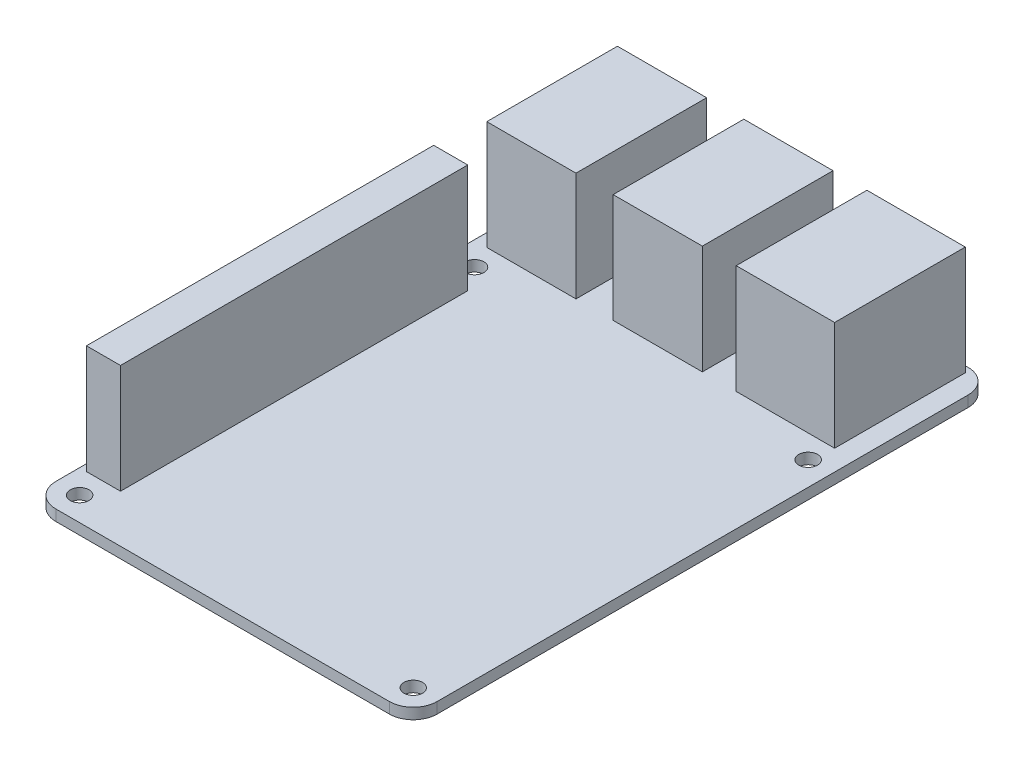
ISO-10303-21;
HEADER;
FILE_DESCRIPTION(('STEP AP214'),'2;1');
FILE_NAME('part.step','',(''),(''),'','','');
FILE_SCHEMA(('AUTOMOTIVE_DESIGN { 1 0 10303 214 1 1 1 1 }'));
ENDSEC;
DATA;
#1=APPLICATION_CONTEXT('core data for automotive mechanical design processes');
#2=APPLICATION_PROTOCOL_DEFINITION('international standard','automotive_design',2000,#1);
#3=PRODUCT_CONTEXT('',#1,'mechanical');
#4=PRODUCT('Part','Part','',(#3));
#5=PRODUCT_RELATED_PRODUCT_CATEGORY('part','',(#4));
#6=PRODUCT_DEFINITION_FORMATION('','',#4);
#7=PRODUCT_DEFINITION_CONTEXT('part definition',#1,'design');
#8=PRODUCT_DEFINITION('design','',#6,#7);
#9=PRODUCT_DEFINITION_SHAPE('','',#8);
#10=(LENGTH_UNIT() NAMED_UNIT(*) SI_UNIT(.MILLI.,.METRE.));
#11=(NAMED_UNIT(*) PLANE_ANGLE_UNIT() SI_UNIT($,.RADIAN.));
#12=(NAMED_UNIT(*) SI_UNIT($,.STERADIAN.) SOLID_ANGLE_UNIT());
#13=UNCERTAINTY_MEASURE_WITH_UNIT(LENGTH_MEASURE(1.E-05),#10,'distance_accuracy_value','');
#14=(GEOMETRIC_REPRESENTATION_CONTEXT(3) GLOBAL_UNCERTAINTY_ASSIGNED_CONTEXT((#13)) GLOBAL_UNIT_ASSIGNED_CONTEXT((#10,
#11,#12)) REPRESENTATION_CONTEXT('',''));
#15=CARTESIAN_POINT('',(0.,0.,0.));
#16=DIRECTION('',(0.,0.,1.));
#17=DIRECTION('',(1.,0.,0.));
#18=AXIS2_PLACEMENT_3D('',#15,#16,#17);
#19=CARTESIAN_POINT('',(0.,1.6,0.));
#20=DIRECTION('',(0.,-1.,0.));
#21=DIRECTION('',(0.,0.,-1.));
#22=AXIS2_PLACEMENT_3D('',#19,#20,#21);
#23=PLANE('',#22);
#24=DIRECTION('',(0.,0.,-1.));
#25=VECTOR('',#24,1.);
#26=CARTESIAN_POINT('',(52.9743321549389,1.6,-64.9067176993025));
#27=LINE('',#26,#25);
#28=CARTESIAN_POINT('',(52.9743321549389,1.6,-64.9067176993025));
#29=VERTEX_POINT('',#28);
#30=CARTESIAN_POINT('',(52.9743321549389,1.6,-84.0963499858589));
#31=VERTEX_POINT('',#30);
#32=EDGE_CURVE('E225',#29,#31,#27,.T.);
#33=ORIENTED_EDGE('',*,*,#32,.F.);
#34=DIRECTION('',(1.,0.,0.));
#35=VECTOR('',#34,1.);
#36=CARTESIAN_POINT('',(38.5256678450611,1.6,-64.9067176993025));
#37=LINE('',#36,#35);
#38=CARTESIAN_POINT('',(38.5256678450611,1.6,-64.9067176993025));
#39=VERTEX_POINT('',#38);
#40=EDGE_CURVE('E241',#39,#29,#37,.T.);
#41=ORIENTED_EDGE('',*,*,#40,.F.);
#42=DIRECTION('',(0.,0.,1.));
#43=VECTOR('',#42,1.);
#44=CARTESIAN_POINT('',(38.5256678450611,1.6,-64.9067176993025));
#45=LINE('',#44,#43);
#46=CARTESIAN_POINT('',(38.5256678450611,1.6,-84.0963499858589));
#47=VERTEX_POINT('',#46);
#48=EDGE_CURVE('E254',#47,#39,#45,.T.);
#49=ORIENTED_EDGE('',*,*,#48,.F.);
#50=DIRECTION('',(-1.,0.,0.));
#51=VECTOR('',#50,1.);
#52=CARTESIAN_POINT('',(38.5256678450611,1.6,-84.0963499858589));
#53=LINE('',#52,#51);
#54=EDGE_CURVE('E230',#31,#47,#53,.T.);
#55=ORIENTED_EDGE('',*,*,#54,.F.);
#56=EDGE_LOOP('',(#33,#41,#49,#55));
#57=FACE_BOUND('',#56,.T.);
#58=DIRECTION('',(0.,0.,-1.));
#59=VECTOR('',#58,1.);
#60=CARTESIAN_POINT('',(14.9885480349821,1.6,-64.9067176993025));
#61=LINE('',#60,#59);
#62=CARTESIAN_POINT('',(14.9885480349821,1.6,-64.9067176993025));
#63=VERTEX_POINT('',#62);
#64=CARTESIAN_POINT('',(14.9885480349821,1.6,-84.0963499858589));
#65=VERTEX_POINT('',#64);
#66=EDGE_CURVE('E321',#63,#65,#61,.T.);
#67=ORIENTED_EDGE('',*,*,#66,.F.);
#68=DIRECTION('',(1.,0.,0.));
#69=VECTOR('',#68,1.);
#70=CARTESIAN_POINT('',(1.88854803498207,1.6,-64.9067176993025));
#71=LINE('',#70,#69);
#72=CARTESIAN_POINT('',(1.88854803498207,1.6,-64.9067176993025));
#73=VERTEX_POINT('',#72);
#74=EDGE_CURVE('E327',#73,#63,#71,.T.);
#75=ORIENTED_EDGE('',*,*,#74,.F.);
#76=DIRECTION('',(0.,0.,1.));
#77=VECTOR('',#76,1.);
#78=CARTESIAN_POINT('',(1.88854803498207,1.6,-64.9067176993025));
#79=LINE('',#78,#77);
#80=CARTESIAN_POINT('',(1.88854803498207,1.6,-84.0963499858589));
#81=VERTEX_POINT('',#80);
#82=EDGE_CURVE('E344',#81,#73,#79,.T.);
#83=ORIENTED_EDGE('',*,*,#82,.F.);
#84=DIRECTION('',(-1.,0.,0.));
#85=VECTOR('',#84,1.);
#86=CARTESIAN_POINT('',(1.88854803498207,1.6,-84.0963499858589));
#87=LINE('',#86,#85);
#88=EDGE_CURVE('E340',#65,#81,#87,.T.);
#89=ORIENTED_EDGE('',*,*,#88,.F.);
#90=EDGE_LOOP('',(#67,#75,#83,#89));
#91=FACE_BOUND('',#90,.T.);
#92=DIRECTION('',(0.,0.,-1.));
#93=VECTOR('',#92,1.);
#94=CARTESIAN_POINT('',(56.,1.6,0.));
#95=LINE('',#94,#93);
#96=CARTESIAN_POINT('',(56.,1.6,-3.5));
#97=VERTEX_POINT('',#96);
#98=CARTESIAN_POINT('',(56.,1.6,-81.5));
#99=VERTEX_POINT('',#98);
#100=EDGE_CURVE('E408',#97,#99,#95,.T.);
#101=ORIENTED_EDGE('',*,*,#100,.T.);
#102=CARTESIAN_POINT('',(52.5,1.6,-81.5));
#103=DIRECTION('',(0.,-1.,0.));
#104=DIRECTION('',(0.,0.,-1.));
#105=AXIS2_PLACEMENT_3D('',#102,#103,#104);
#106=CIRCLE('',#105,3.5);
#107=CARTESIAN_POINT('',(52.5,1.6,-85.));
#108=VERTEX_POINT('',#107);
#109=EDGE_CURVE('E465',#99,#108,#106,.F.);
#110=ORIENTED_EDGE('',*,*,#109,.T.);
#111=DIRECTION('',(-1.,0.,0.));
#112=VECTOR('',#111,1.);
#113=CARTESIAN_POINT('',(0.,1.6,-85.));
#114=LINE('',#113,#112);
#115=CARTESIAN_POINT('',(3.5,1.6,-85.));
#116=VERTEX_POINT('',#115);
#117=EDGE_CURVE('E412',#108,#116,#114,.T.);
#118=ORIENTED_EDGE('',*,*,#117,.T.);
#119=CARTESIAN_POINT('',(3.5,1.6,-81.5));
#120=DIRECTION('',(0.,-1.,0.));
#121=DIRECTION('',(0.,0.,-1.));
#122=AXIS2_PLACEMENT_3D('',#119,#120,#121);
#123=CIRCLE('',#122,3.5);
#124=CARTESIAN_POINT('',(0.,1.6,-81.5));
#125=VERTEX_POINT('',#124);
#126=EDGE_CURVE('E462',#116,#125,#123,.F.);
#127=ORIENTED_EDGE('',*,*,#126,.T.);
#128=DIRECTION('',(0.,0.,1.));
#129=VECTOR('',#128,1.);
#130=CARTESIAN_POINT('',(0.,1.6,0.));
#131=LINE('',#130,#129);
#132=CARTESIAN_POINT('',(0.,1.6,-3.5));
#133=VERTEX_POINT('',#132);
#134=EDGE_CURVE('E399',#125,#133,#131,.T.);
#135=ORIENTED_EDGE('',*,*,#134,.T.);
#136=CARTESIAN_POINT('',(3.5,1.6,-3.5));
#137=DIRECTION('',(0.,-1.,0.));
#138=DIRECTION('',(0.,0.,-1.));
#139=AXIS2_PLACEMENT_3D('',#136,#137,#138);
#140=CIRCLE('',#139,3.5);
#141=CARTESIAN_POINT('',(3.5,1.6,0.));
#142=VERTEX_POINT('',#141);
#143=EDGE_CURVE('E459',#133,#142,#140,.F.);
#144=ORIENTED_EDGE('',*,*,#143,.T.);
#145=DIRECTION('',(1.,0.,0.));
#146=VECTOR('',#145,1.);
#147=CARTESIAN_POINT('',(0.,1.6,0.));
#148=LINE('',#147,#146);
#149=CARTESIAN_POINT('',(52.5,1.6,0.));
#150=VERTEX_POINT('',#149);
#151=EDGE_CURVE('E403',#142,#150,#148,.T.);
#152=ORIENTED_EDGE('',*,*,#151,.T.);
#153=CARTESIAN_POINT('',(52.5,1.6,-3.5));
#154=DIRECTION('',(0.,-1.,0.));
#155=DIRECTION('',(0.,0.,-1.));
#156=AXIS2_PLACEMENT_3D('',#153,#154,#155);
#157=CIRCLE('',#156,3.5);
#158=EDGE_CURVE('E456',#150,#97,#157,.F.);
#159=ORIENTED_EDGE('',*,*,#158,.T.);
#160=EDGE_LOOP('',(#101,#110,#118,#127,#135,#144,#152,#159));
#161=FACE_BOUND('',#160,.T.);
#162=CARTESIAN_POINT('',(3.5,1.6,-3.5));
#163=DIRECTION('',(0.,1.,0.));
#164=DIRECTION('',(0.,0.,1.));
#165=AXIS2_PLACEMENT_3D('',#162,#163,#164);
#166=CIRCLE('',#165,1.375);
#167=CARTESIAN_POINT('',(3.5,1.6,-2.125));
#168=VERTEX_POINT('',#167);
#169=EDGE_CURVE('E391',#168,#168,#166,.T.);
#170=ORIENTED_EDGE('',*,*,#169,.F.);
#171=EDGE_LOOP('',(#170));
#172=FACE_BOUND('',#171,.T.);
#173=CARTESIAN_POINT('',(52.5,1.6,-3.5));
#174=DIRECTION('',(0.,1.,0.));
#175=DIRECTION('',(0.,0.,1.));
#176=AXIS2_PLACEMENT_3D('',#173,#174,#175);
#177=CIRCLE('',#176,1.375);
#178=CARTESIAN_POINT('',(52.5,1.6,-2.125));
#179=VERTEX_POINT('',#178);
#180=EDGE_CURVE('E383',#179,#179,#177,.T.);
#181=ORIENTED_EDGE('',*,*,#180,.F.);
#182=EDGE_LOOP('',(#181));
#183=FACE_BOUND('',#182,.T.);
#184=CARTESIAN_POINT('',(52.5,1.6,-61.5));
#185=DIRECTION('',(0.,1.,0.));
#186=DIRECTION('',(0.,0.,1.));
#187=AXIS2_PLACEMENT_3D('',#184,#185,#186);
#188=CIRCLE('',#187,1.375);
#189=CARTESIAN_POINT('',(52.5,1.6,-60.125));
#190=VERTEX_POINT('',#189);
#191=EDGE_CURVE('E375',#190,#190,#188,.T.);
#192=ORIENTED_EDGE('',*,*,#191,.F.);
#193=EDGE_LOOP('',(#192));
#194=FACE_BOUND('',#193,.T.);
#195=CARTESIAN_POINT('',(3.5,1.6,-61.5));
#196=DIRECTION('',(0.,1.,0.));
#197=DIRECTION('',(0.,0.,1.));
#198=AXIS2_PLACEMENT_3D('',#195,#196,#197);
#199=CIRCLE('',#198,1.375);
#200=CARTESIAN_POINT('',(3.5,1.6,-60.125));
#201=VERTEX_POINT('',#200);
#202=EDGE_CURVE('E367',#201,#201,#199,.T.);
#203=ORIENTED_EDGE('',*,*,#202,.F.);
#204=EDGE_LOOP('',(#203));
#205=FACE_BOUND('',#204,.T.);
#206=DIRECTION('',(0.,0.,-1.));
#207=VECTOR('',#206,1.);
#208=CARTESIAN_POINT('',(33.55,1.6,-64.9067176993025));
#209=LINE('',#208,#207);
#210=CARTESIAN_POINT('',(33.55,1.6,-64.9067176993025));
#211=VERTEX_POINT('',#210);
#212=CARTESIAN_POINT('',(33.55,1.6,-84.0963499858589));
#213=VERTEX_POINT('',#212);
#214=EDGE_CURVE('E276',#211,#213,#209,.T.);
#215=ORIENTED_EDGE('',*,*,#214,.F.);
#216=DIRECTION('',(1.,0.,0.));
#217=VECTOR('',#216,1.);
#218=CARTESIAN_POINT('',(20.45,1.6,-64.9067176993025));
#219=LINE('',#218,#217);
#220=CARTESIAN_POINT('',(20.45,1.6,-64.9067176993025));
#221=VERTEX_POINT('',#220);
#222=EDGE_CURVE('E282',#221,#211,#219,.T.);
#223=ORIENTED_EDGE('',*,*,#222,.F.);
#224=DIRECTION('',(0.,0.,1.));
#225=VECTOR('',#224,1.);
#226=CARTESIAN_POINT('',(20.45,1.6,-64.9067176993025));
#227=LINE('',#226,#225);
#228=CARTESIAN_POINT('',(20.45,1.6,-84.0963499858589));
#229=VERTEX_POINT('',#228);
#230=EDGE_CURVE('E299',#229,#221,#227,.T.);
#231=ORIENTED_EDGE('',*,*,#230,.F.);
#232=DIRECTION('',(-1.,0.,0.));
#233=VECTOR('',#232,1.);
#234=CARTESIAN_POINT('',(20.45,1.6,-84.0963499858589));
#235=LINE('',#234,#233);
#236=EDGE_CURVE('E295',#213,#229,#235,.T.);
#237=ORIENTED_EDGE('',*,*,#236,.F.);
#238=EDGE_LOOP('',(#215,#223,#231,#237));
#239=FACE_BOUND('',#238,.T.);
#240=DIRECTION('',(0.,0.,-1.));
#241=VECTOR('',#240,1.);
#242=CARTESIAN_POINT('',(6.,1.6,-7.00000000000001));
#243=LINE('',#242,#241);
#244=CARTESIAN_POINT('',(6.,1.6,-7.00000000000001));
#245=VERTEX_POINT('',#244);
#246=CARTESIAN_POINT('',(6.,1.6,-58.));
#247=VERTEX_POINT('',#246);
#248=EDGE_CURVE('E223',#245,#247,#243,.T.);
#249=ORIENTED_EDGE('',*,*,#248,.F.);
#250=DIRECTION('',(1.,0.,0.));
#251=VECTOR('',#250,1.);
#252=CARTESIAN_POINT('',(1.,1.6,-7.00000000000001));
#253=LINE('',#252,#251);
#254=CARTESIAN_POINT('',(1.,1.6,-7.00000000000001));
#255=VERTEX_POINT('',#254);
#256=EDGE_CURVE('E220',#255,#245,#253,.T.);
#257=ORIENTED_EDGE('',*,*,#256,.F.);
#258=DIRECTION('',(0.,0.,1.));
#259=VECTOR('',#258,1.);
#260=CARTESIAN_POINT('',(1.,1.6,-7.00000000000001));
#261=LINE('',#260,#259);
#262=CARTESIAN_POINT('',(1.,1.6,-58.));
#263=VERTEX_POINT('',#262);
#264=EDGE_CURVE('E60',#263,#255,#261,.T.);
#265=ORIENTED_EDGE('',*,*,#264,.F.);
#266=DIRECTION('',(-1.,0.,0.));
#267=VECTOR('',#266,1.);
#268=CARTESIAN_POINT('',(1.,1.6,-58.));
#269=LINE('',#268,#267);
#270=EDGE_CURVE('E55',#247,#263,#269,.T.);
#271=ORIENTED_EDGE('',*,*,#270,.F.);
#272=EDGE_LOOP('',(#249,#257,#265,#271));
#273=FACE_BOUND('',#272,.T.);
#274=ADVANCED_FACE('F39',(#57,#91,#161,#172,#183,#194,#205,#239,#273),#23,.F.);
#275=CARTESIAN_POINT('',(0.,0.,0.));
#276=DIRECTION('',(0.,-1.,0.));
#277=DIRECTION('',(0.,0.,-1.));
#278=AXIS2_PLACEMENT_3D('',#275,#276,#277);
#279=PLANE('',#278);
#280=CARTESIAN_POINT('',(52.5,0.,-61.5));
#281=DIRECTION('',(0.,1.,0.));
#282=DIRECTION('',(0.,0.,1.));
#283=AXIS2_PLACEMENT_3D('',#280,#281,#282);
#284=CIRCLE('',#283,1.375);
#285=CARTESIAN_POINT('',(52.5,0.,-60.125));
#286=VERTEX_POINT('',#285);
#287=EDGE_CURVE('E371',#286,#286,#284,.T.);
#288=ORIENTED_EDGE('',*,*,#287,.T.);
#289=EDGE_LOOP('',(#288));
#290=FACE_BOUND('',#289,.T.);
#291=CARTESIAN_POINT('',(3.5,0.,-3.5));
#292=DIRECTION('',(0.,1.,0.));
#293=DIRECTION('',(0.,0.,1.));
#294=AXIS2_PLACEMENT_3D('',#291,#292,#293);
#295=CIRCLE('',#294,1.375);
#296=CARTESIAN_POINT('',(3.5,0.,-2.125));
#297=VERTEX_POINT('',#296);
#298=EDGE_CURVE('E387',#297,#297,#295,.T.);
#299=ORIENTED_EDGE('',*,*,#298,.T.);
#300=EDGE_LOOP('',(#299));
#301=FACE_BOUND('',#300,.T.);
#302=DIRECTION('',(-1.,0.,0.));
#303=VECTOR('',#302,1.);
#304=CARTESIAN_POINT('',(0.,0.,-85.));
#305=LINE('',#304,#303);
#306=CARTESIAN_POINT('',(52.5,0.,-85.));
#307=VERTEX_POINT('',#306);
#308=CARTESIAN_POINT('',(3.5,0.,-85.));
#309=VERTEX_POINT('',#308);
#310=EDGE_CURVE('E404',#307,#309,#305,.T.);
#311=ORIENTED_EDGE('',*,*,#310,.F.);
#312=CARTESIAN_POINT('',(52.5,0.,-81.5));
#313=DIRECTION('',(0.,-1.,0.));
#314=DIRECTION('',(0.,0.,-1.));
#315=AXIS2_PLACEMENT_3D('',#312,#313,#314);
#316=CIRCLE('',#315,3.5);
#317=CARTESIAN_POINT('',(56.,0.,-81.5));
#318=VERTEX_POINT('',#317);
#319=EDGE_CURVE('E446',#307,#318,#316,.T.);
#320=ORIENTED_EDGE('',*,*,#319,.T.);
#321=DIRECTION('',(0.,0.,-1.));
#322=VECTOR('',#321,1.);
#323=CARTESIAN_POINT('',(56.,0.,0.));
#324=LINE('',#323,#322);
#325=CARTESIAN_POINT('',(56.,0.,-3.5));
#326=VERTEX_POINT('',#325);
#327=EDGE_CURVE('E424',#326,#318,#324,.T.);
#328=ORIENTED_EDGE('',*,*,#327,.F.);
#329=CARTESIAN_POINT('',(52.5,0.,-3.5));
#330=DIRECTION('',(0.,-1.,0.));
#331=DIRECTION('',(0.,0.,-1.));
#332=AXIS2_PLACEMENT_3D('',#329,#330,#331);
#333=CIRCLE('',#332,3.5);
#334=CARTESIAN_POINT('',(52.5,0.,0.));
#335=VERTEX_POINT('',#334);
#336=EDGE_CURVE('E437',#326,#335,#333,.T.);
#337=ORIENTED_EDGE('',*,*,#336,.T.);
#338=DIRECTION('',(1.,0.,0.));
#339=VECTOR('',#338,1.);
#340=CARTESIAN_POINT('',(0.,0.,0.));
#341=LINE('',#340,#339);
#342=CARTESIAN_POINT('',(3.5,0.,0.));
#343=VERTEX_POINT('',#342);
#344=EDGE_CURVE('E420',#343,#335,#341,.T.);
#345=ORIENTED_EDGE('',*,*,#344,.F.);
#346=CARTESIAN_POINT('',(3.5,0.,-3.5));
#347=DIRECTION('',(0.,-1.,0.));
#348=DIRECTION('',(0.,0.,-1.));
#349=AXIS2_PLACEMENT_3D('',#346,#347,#348);
#350=CIRCLE('',#349,3.5);
#351=CARTESIAN_POINT('',(0.,0.,-3.5));
#352=VERTEX_POINT('',#351);
#353=EDGE_CURVE('E440',#343,#352,#350,.T.);
#354=ORIENTED_EDGE('',*,*,#353,.T.);
#355=DIRECTION('',(0.,0.,1.));
#356=VECTOR('',#355,1.);
#357=CARTESIAN_POINT('',(0.,0.,0.));
#358=LINE('',#357,#356);
#359=CARTESIAN_POINT('',(0.,0.,-81.5));
#360=VERTEX_POINT('',#359);
#361=EDGE_CURVE('E395',#360,#352,#358,.T.);
#362=ORIENTED_EDGE('',*,*,#361,.F.);
#363=CARTESIAN_POINT('',(3.5,0.,-81.5));
#364=DIRECTION('',(0.,-1.,0.));
#365=DIRECTION('',(0.,0.,-1.));
#366=AXIS2_PLACEMENT_3D('',#363,#364,#365);
#367=CIRCLE('',#366,3.5);
#368=EDGE_CURVE('E443',#360,#309,#367,.T.);
#369=ORIENTED_EDGE('',*,*,#368,.T.);
#370=EDGE_LOOP('',(#311,#320,#328,#337,#345,#354,#362,#369));
#371=FACE_BOUND('',#370,.T.);
#372=CARTESIAN_POINT('',(52.5,0.,-3.5));
#373=DIRECTION('',(0.,1.,0.));
#374=DIRECTION('',(0.,0.,1.));
#375=AXIS2_PLACEMENT_3D('',#372,#373,#374);
#376=CIRCLE('',#375,1.375);
#377=CARTESIAN_POINT('',(52.5,0.,-2.125));
#378=VERTEX_POINT('',#377);
#379=EDGE_CURVE('E379',#378,#378,#376,.T.);
#380=ORIENTED_EDGE('',*,*,#379,.T.);
#381=EDGE_LOOP('',(#380));
#382=FACE_BOUND('',#381,.T.);
#383=CARTESIAN_POINT('',(3.5,0.,-61.5));
#384=DIRECTION('',(0.,1.,0.));
#385=DIRECTION('',(0.,0.,1.));
#386=AXIS2_PLACEMENT_3D('',#383,#384,#385);
#387=CIRCLE('',#386,1.375);
#388=CARTESIAN_POINT('',(3.5,0.,-60.125));
#389=VERTEX_POINT('',#388);
#390=EDGE_CURVE('E366',#389,#389,#387,.T.);
#391=ORIENTED_EDGE('',*,*,#390,.T.);
#392=EDGE_LOOP('',(#391));
#393=FACE_BOUND('',#392,.T.);
#394=ADVANCED_FACE('F494',(#290,#301,#371,#382,#393),#279,.T.);
#395=CARTESIAN_POINT('',(0.,1.6,0.));
#396=DIRECTION('',(1.,0.,0.));
#397=DIRECTION('',(0.,0.,-1.));
#398=AXIS2_PLACEMENT_3D('',#395,#396,#397);
#399=PLANE('',#398);
#400=ORIENTED_EDGE('',*,*,#134,.F.);
#401=DIRECTION('',(0.,-1.,0.));
#402=VECTOR('',#401,1.);
#403=CARTESIAN_POINT('',(0.,1.6,-81.5));
#404=LINE('',#403,#402);
#405=EDGE_CURVE('E471',#125,#360,#404,.T.);
#406=ORIENTED_EDGE('',*,*,#405,.T.);
#407=ORIENTED_EDGE('',*,*,#361,.T.);
#408=DIRECTION('',(0.,-1.,0.));
#409=VECTOR('',#408,1.);
#410=CARTESIAN_POINT('',(0.,1.6,-3.5));
#411=LINE('',#410,#409);
#412=EDGE_CURVE('E468',#352,#133,#411,.F.);
#413=ORIENTED_EDGE('',*,*,#412,.T.);
#414=EDGE_LOOP('',(#400,#406,#407,#413));
#415=FACE_BOUND('',#414,.T.);
#416=ADVANCED_FACE('F511',(#415),#399,.F.);
#417=CARTESIAN_POINT('',(0.,1.6,0.));
#418=DIRECTION('',(0.,0.,-1.));
#419=DIRECTION('',(-1.,0.,0.));
#420=AXIS2_PLACEMENT_3D('',#417,#418,#419);
#421=PLANE('',#420);
#422=ORIENTED_EDGE('',*,*,#151,.F.);
#423=DIRECTION('',(0.,-1.,0.));
#424=VECTOR('',#423,1.);
#425=CARTESIAN_POINT('',(3.5,1.6,0.));
#426=LINE('',#425,#424);
#427=EDGE_CURVE('E11',#142,#343,#426,.T.);
#428=ORIENTED_EDGE('',*,*,#427,.T.);
#429=ORIENTED_EDGE('',*,*,#344,.T.);
#430=DIRECTION('',(0.,-1.,0.));
#431=VECTOR('',#430,1.);
#432=CARTESIAN_POINT('',(52.5,1.6,0.));
#433=LINE('',#432,#431);
#434=EDGE_CURVE('E48',#335,#150,#433,.F.);
#435=ORIENTED_EDGE('',*,*,#434,.T.);
#436=EDGE_LOOP('',(#422,#428,#429,#435));
#437=FACE_BOUND('',#436,.T.);
#438=ADVANCED_FACE('F478',(#437),#421,.F.);
#439=CARTESIAN_POINT('',(56.,1.6,0.));
#440=DIRECTION('',(-1.,0.,0.));
#441=DIRECTION('',(0.,0.,1.));
#442=AXIS2_PLACEMENT_3D('',#439,#440,#441);
#443=PLANE('',#442);
#444=ORIENTED_EDGE('',*,*,#327,.T.);
#445=DIRECTION('',(0.,-1.,0.));
#446=VECTOR('',#445,1.);
#447=CARTESIAN_POINT('',(56.,1.6,-81.5));
#448=LINE('',#447,#446);
#449=EDGE_CURVE('E453',#318,#99,#448,.F.);
#450=ORIENTED_EDGE('',*,*,#449,.T.);
#451=ORIENTED_EDGE('',*,*,#100,.F.);
#452=DIRECTION('',(0.,-1.,0.));
#453=VECTOR('',#452,1.);
#454=CARTESIAN_POINT('',(56.,1.6,-3.5));
#455=LINE('',#454,#453);
#456=EDGE_CURVE('E449',#97,#326,#455,.T.);
#457=ORIENTED_EDGE('',*,*,#456,.T.);
#458=EDGE_LOOP('',(#444,#450,#451,#457));
#459=FACE_BOUND('',#458,.T.);
#460=ADVANCED_FACE('F490',(#459),#443,.F.);
#461=CARTESIAN_POINT('',(0.,1.6,-85.));
#462=DIRECTION('',(0.,0.,1.));
#463=DIRECTION('',(1.,0.,0.));
#464=AXIS2_PLACEMENT_3D('',#461,#462,#463);
#465=PLANE('',#464);
#466=ORIENTED_EDGE('',*,*,#117,.F.);
#467=DIRECTION('',(0.,-1.,0.));
#468=VECTOR('',#467,1.);
#469=CARTESIAN_POINT('',(52.5,1.6,-85.));
#470=LINE('',#469,#468);
#471=EDGE_CURVE('E433',#108,#307,#470,.T.);
#472=ORIENTED_EDGE('',*,*,#471,.T.);
#473=ORIENTED_EDGE('',*,*,#310,.T.);
#474=DIRECTION('',(0.,-1.,0.));
#475=VECTOR('',#474,1.);
#476=CARTESIAN_POINT('',(3.5,1.6,-85.));
#477=LINE('',#476,#475);
#478=EDGE_CURVE('E416',#309,#116,#477,.F.);
#479=ORIENTED_EDGE('',*,*,#478,.T.);
#480=EDGE_LOOP('',(#466,#472,#473,#479));
#481=FACE_BOUND('',#480,.T.);
#482=ADVANCED_FACE('F502',(#481),#465,.F.);
#483=CARTESIAN_POINT('',(3.5,1.6,-3.5));
#484=DIRECTION('',(0.,-1.,0.));
#485=DIRECTION('',(0.,0.,-1.));
#486=AXIS2_PLACEMENT_3D('',#483,#484,#485);
#487=CYLINDRICAL_SURFACE('',#486,1.375);
#488=ORIENTED_EDGE('',*,*,#169,.T.);
#489=EDGE_LOOP('',(#488));
#490=FACE_BOUND('',#489,.T.);
#491=ORIENTED_EDGE('',*,*,#298,.F.);
#492=EDGE_LOOP('',(#491));
#493=FACE_BOUND('',#492,.T.);
#494=ADVANCED_FACE('F532',(#490,#493),#487,.F.);
#495=CARTESIAN_POINT('',(52.5,1.6,-3.5));
#496=DIRECTION('',(0.,-1.,0.));
#497=DIRECTION('',(0.,0.,-1.));
#498=AXIS2_PLACEMENT_3D('',#495,#496,#497);
#499=CYLINDRICAL_SURFACE('',#498,1.375);
#500=ORIENTED_EDGE('',*,*,#180,.T.);
#501=EDGE_LOOP('',(#500));
#502=FACE_BOUND('',#501,.T.);
#503=ORIENTED_EDGE('',*,*,#379,.F.);
#504=EDGE_LOOP('',(#503));
#505=FACE_BOUND('',#504,.T.);
#506=ADVANCED_FACE('F554',(#502,#505),#499,.F.);
#507=CARTESIAN_POINT('',(52.5,1.6,-61.5));
#508=DIRECTION('',(0.,-1.,0.));
#509=DIRECTION('',(0.,0.,-1.));
#510=AXIS2_PLACEMENT_3D('',#507,#508,#509);
#511=CYLINDRICAL_SURFACE('',#510,1.375);
#512=ORIENTED_EDGE('',*,*,#191,.T.);
#513=EDGE_LOOP('',(#512));
#514=FACE_BOUND('',#513,.T.);
#515=ORIENTED_EDGE('',*,*,#287,.F.);
#516=EDGE_LOOP('',(#515));
#517=FACE_BOUND('',#516,.T.);
#518=ADVANCED_FACE('F548',(#514,#517),#511,.F.);
#519=CARTESIAN_POINT('',(3.5,1.6,-61.5));
#520=DIRECTION('',(0.,-1.,0.));
#521=DIRECTION('',(0.,0.,-1.));
#522=AXIS2_PLACEMENT_3D('',#519,#520,#521);
#523=CYLINDRICAL_SURFACE('',#522,1.375);
#524=ORIENTED_EDGE('',*,*,#202,.T.);
#525=EDGE_LOOP('',(#524));
#526=FACE_BOUND('',#525,.T.);
#527=ORIENTED_EDGE('',*,*,#390,.F.);
#528=EDGE_LOOP('',(#527));
#529=FACE_BOUND('',#528,.T.);
#530=ADVANCED_FACE('F544',(#526,#529),#523,.F.);
#531=CARTESIAN_POINT('',(52.5,1.6,-81.5));
#532=DIRECTION('',(0.,-1.,0.));
#533=DIRECTION('',(0.,0.,-1.));
#534=AXIS2_PLACEMENT_3D('',#531,#532,#533);
#535=CYLINDRICAL_SURFACE('',#534,3.5);
#536=ORIENTED_EDGE('',*,*,#109,.F.);
#537=ORIENTED_EDGE('',*,*,#449,.F.);
#538=ORIENTED_EDGE('',*,*,#319,.F.);
#539=ORIENTED_EDGE('',*,*,#471,.F.);
#540=EDGE_LOOP('',(#536,#537,#538,#539));
#541=FACE_BOUND('',#540,.T.);
#542=ADVANCED_FACE('F499',(#541),#535,.T.);
#543=CARTESIAN_POINT('',(3.5,1.6,-81.5));
#544=DIRECTION('',(0.,-1.,0.));
#545=DIRECTION('',(0.,0.,-1.));
#546=AXIS2_PLACEMENT_3D('',#543,#544,#545);
#547=CYLINDRICAL_SURFACE('',#546,3.5);
#548=ORIENTED_EDGE('',*,*,#126,.F.);
#549=ORIENTED_EDGE('',*,*,#478,.F.);
#550=ORIENTED_EDGE('',*,*,#368,.F.);
#551=ORIENTED_EDGE('',*,*,#405,.F.);
#552=EDGE_LOOP('',(#548,#549,#550,#551));
#553=FACE_BOUND('',#552,.T.);
#554=ADVANCED_FACE('F508',(#553),#547,.T.);
#555=CARTESIAN_POINT('',(3.5,1.6,-3.5));
#556=DIRECTION('',(0.,-1.,0.));
#557=DIRECTION('',(0.,0.,-1.));
#558=AXIS2_PLACEMENT_3D('',#555,#556,#557);
#559=CYLINDRICAL_SURFACE('',#558,3.5);
#560=ORIENTED_EDGE('',*,*,#143,.F.);
#561=ORIENTED_EDGE('',*,*,#412,.F.);
#562=ORIENTED_EDGE('',*,*,#353,.F.);
#563=ORIENTED_EDGE('',*,*,#427,.F.);
#564=EDGE_LOOP('',(#560,#561,#562,#563));
#565=FACE_BOUND('',#564,.T.);
#566=ADVANCED_FACE('F514',(#565),#559,.T.);
#567=CARTESIAN_POINT('',(52.5,1.6,-3.5));
#568=DIRECTION('',(0.,-1.,0.));
#569=DIRECTION('',(0.,0.,-1.));
#570=AXIS2_PLACEMENT_3D('',#567,#568,#569);
#571=CYLINDRICAL_SURFACE('',#570,3.5);
#572=ORIENTED_EDGE('',*,*,#158,.F.);
#573=ORIENTED_EDGE('',*,*,#434,.F.);
#574=ORIENTED_EDGE('',*,*,#336,.F.);
#575=ORIENTED_EDGE('',*,*,#456,.F.);
#576=EDGE_LOOP('',(#572,#573,#574,#575));
#577=FACE_BOUND('',#576,.T.);
#578=ADVANCED_FACE('F41',(#577),#571,.T.);
#579=CARTESIAN_POINT('',(14.9885480349821,17.6,-64.9067176993025));
#580=DIRECTION('',(-1.,0.,0.));
#581=DIRECTION('',(0.,0.,1.));
#582=AXIS2_PLACEMENT_3D('',#579,#580,#581);
#583=PLANE('',#582);
#584=ORIENTED_EDGE('',*,*,#66,.T.);
#585=DIRECTION('',(0.,-1.,0.));
#586=VECTOR('',#585,1.);
#587=CARTESIAN_POINT('',(14.9885480349821,17.6,-84.0963499858589));
#588=LINE('',#587,#586);
#589=CARTESIAN_POINT('',(14.9885480349821,17.6,-84.0963499858589));
#590=VERTEX_POINT('',#589);
#591=EDGE_CURVE('E362',#590,#65,#588,.T.);
#592=ORIENTED_EDGE('',*,*,#591,.F.);
#593=DIRECTION('',(0.,0.,-1.));
#594=VECTOR('',#593,1.);
#595=CARTESIAN_POINT('',(14.9885480349821,17.6,-64.9067176993025));
#596=LINE('',#595,#594);
#597=CARTESIAN_POINT('',(14.9885480349821,17.6,-64.9067176993025));
#598=VERTEX_POINT('',#597);
#599=EDGE_CURVE('E322',#598,#590,#596,.T.);
#600=ORIENTED_EDGE('',*,*,#599,.F.);
#601=DIRECTION('',(0.,-1.,0.));
#602=VECTOR('',#601,1.);
#603=CARTESIAN_POINT('',(14.9885480349821,17.6,-64.9067176993025));
#604=LINE('',#603,#602);
#605=EDGE_CURVE('E336',#598,#63,#604,.T.);
#606=ORIENTED_EDGE('',*,*,#605,.T.);
#607=EDGE_LOOP('',(#584,#592,#600,#606));
#608=FACE_BOUND('',#607,.T.);
#609=ADVANCED_FACE('F520',(#608),#583,.F.);
#610=CARTESIAN_POINT('',(1.88854803498207,17.6,-84.0963499858589));
#611=DIRECTION('',(0.,0.,1.));
#612=DIRECTION('',(1.,0.,0.));
#613=AXIS2_PLACEMENT_3D('',#610,#611,#612);
#614=PLANE('',#613);
#615=ORIENTED_EDGE('',*,*,#88,.T.);
#616=DIRECTION('',(0.,-1.,0.));
#617=VECTOR('',#616,1.);
#618=CARTESIAN_POINT('',(1.88854803498207,17.6,-84.0963499858589));
#619=LINE('',#618,#617);
#620=CARTESIAN_POINT('',(1.88854803498207,17.6,-84.0963499858589));
#621=VERTEX_POINT('',#620);
#622=EDGE_CURVE('E358',#621,#81,#619,.T.);
#623=ORIENTED_EDGE('',*,*,#622,.F.);
#624=DIRECTION('',(-1.,0.,0.));
#625=VECTOR('',#624,1.);
#626=CARTESIAN_POINT('',(1.88854803498207,17.6,-84.0963499858589));
#627=LINE('',#626,#625);
#628=EDGE_CURVE('E326',#590,#621,#627,.T.);
#629=ORIENTED_EDGE('',*,*,#628,.F.);
#630=ORIENTED_EDGE('',*,*,#591,.T.);
#631=EDGE_LOOP('',(#615,#623,#629,#630));
#632=FACE_BOUND('',#631,.T.);
#633=ADVANCED_FACE('F662',(#632),#614,.F.);
#634=CARTESIAN_POINT('',(1.88854803498207,17.6,-64.9067176993025));
#635=DIRECTION('',(1.,0.,0.));
#636=DIRECTION('',(0.,0.,-1.));
#637=AXIS2_PLACEMENT_3D('',#634,#635,#636);
#638=PLANE('',#637);
#639=ORIENTED_EDGE('',*,*,#82,.T.);
#640=DIRECTION('',(0.,-1.,0.));
#641=VECTOR('',#640,1.);
#642=CARTESIAN_POINT('',(1.88854803498207,17.6,-64.9067176993025));
#643=LINE('',#642,#641);
#644=CARTESIAN_POINT('',(1.88854803498207,17.6,-64.9067176993025));
#645=VERTEX_POINT('',#644);
#646=EDGE_CURVE('E354',#645,#73,#643,.T.);
#647=ORIENTED_EDGE('',*,*,#646,.F.);
#648=DIRECTION('',(0.,0.,1.));
#649=VECTOR('',#648,1.);
#650=CARTESIAN_POINT('',(1.88854803498207,17.6,-64.9067176993025));
#651=LINE('',#650,#649);
#652=EDGE_CURVE('E330',#621,#645,#651,.T.);
#653=ORIENTED_EDGE('',*,*,#652,.F.);
#654=ORIENTED_EDGE('',*,*,#622,.T.);
#655=EDGE_LOOP('',(#639,#647,#653,#654));
#656=FACE_BOUND('',#655,.T.);
#657=ADVANCED_FACE('F659',(#656),#638,.F.);
#658=CARTESIAN_POINT('',(1.88854803498207,17.6,-64.9067176993025));
#659=DIRECTION('',(0.,0.,-1.));
#660=DIRECTION('',(-1.,0.,0.));
#661=AXIS2_PLACEMENT_3D('',#658,#659,#660);
#662=PLANE('',#661);
#663=ORIENTED_EDGE('',*,*,#74,.T.);
#664=ORIENTED_EDGE('',*,*,#605,.F.);
#665=DIRECTION('',(1.,0.,0.));
#666=VECTOR('',#665,1.);
#667=CARTESIAN_POINT('',(1.88854803498207,17.6,-64.9067176993025));
#668=LINE('',#667,#666);
#669=EDGE_CURVE('E333',#645,#598,#668,.T.);
#670=ORIENTED_EDGE('',*,*,#669,.F.);
#671=ORIENTED_EDGE('',*,*,#646,.T.);
#672=EDGE_LOOP('',(#663,#664,#670,#671));
#673=FACE_BOUND('',#672,.T.);
#674=ADVANCED_FACE('F655',(#673),#662,.F.);
#675=CARTESIAN_POINT('',(0.,17.6,0.));
#676=DIRECTION('',(0.,-1.,0.));
#677=DIRECTION('',(0.,0.,-1.));
#678=AXIS2_PLACEMENT_3D('',#675,#676,#677);
#679=PLANE('',#678);
#680=ORIENTED_EDGE('',*,*,#599,.T.);
#681=ORIENTED_EDGE('',*,*,#628,.T.);
#682=ORIENTED_EDGE('',*,*,#652,.T.);
#683=ORIENTED_EDGE('',*,*,#669,.T.);
#684=EDGE_LOOP('',(#680,#681,#682,#683));
#685=FACE_BOUND('',#684,.T.);
#686=ADVANCED_FACE('F651',(#685),#679,.F.);
#687=CARTESIAN_POINT('',(33.55,17.6,-64.9067176993025));
#688=DIRECTION('',(-1.,0.,0.));
#689=DIRECTION('',(0.,0.,1.));
#690=AXIS2_PLACEMENT_3D('',#687,#688,#689);
#691=PLANE('',#690);
#692=ORIENTED_EDGE('',*,*,#214,.T.);
#693=DIRECTION('',(0.,-1.,0.));
#694=VECTOR('',#693,1.);
#695=CARTESIAN_POINT('',(33.55,17.6,-84.0963499858589));
#696=LINE('',#695,#694);
#697=CARTESIAN_POINT('',(33.55,17.6,-84.0963499858589));
#698=VERTEX_POINT('',#697);
#699=EDGE_CURVE('E317',#698,#213,#696,.T.);
#700=ORIENTED_EDGE('',*,*,#699,.F.);
#701=DIRECTION('',(0.,0.,-1.));
#702=VECTOR('',#701,1.);
#703=CARTESIAN_POINT('',(33.55,17.6,-64.9067176993025));
#704=LINE('',#703,#702);
#705=CARTESIAN_POINT('',(33.55,17.6,-64.9067176993025));
#706=VERTEX_POINT('',#705);
#707=EDGE_CURVE('E277',#706,#698,#704,.T.);
#708=ORIENTED_EDGE('',*,*,#707,.F.);
#709=DIRECTION('',(0.,-1.,0.));
#710=VECTOR('',#709,1.);
#711=CARTESIAN_POINT('',(33.55,17.6,-64.9067176993025));
#712=LINE('',#711,#710);
#713=EDGE_CURVE('E291',#706,#211,#712,.T.);
#714=ORIENTED_EDGE('',*,*,#713,.T.);
#715=EDGE_LOOP('',(#692,#700,#708,#714));
#716=FACE_BOUND('',#715,.T.);
#717=ADVANCED_FACE('F647',(#716),#691,.F.);
#718=CARTESIAN_POINT('',(20.45,17.6,-84.0963499858589));
#719=DIRECTION('',(0.,0.,1.));
#720=DIRECTION('',(1.,0.,0.));
#721=AXIS2_PLACEMENT_3D('',#718,#719,#720);
#722=PLANE('',#721);
#723=ORIENTED_EDGE('',*,*,#236,.T.);
#724=DIRECTION('',(0.,-1.,0.));
#725=VECTOR('',#724,1.);
#726=CARTESIAN_POINT('',(20.45,17.6,-84.0963499858589));
#727=LINE('',#726,#725);
#728=CARTESIAN_POINT('',(20.45,17.6,-84.0963499858589));
#729=VERTEX_POINT('',#728);
#730=EDGE_CURVE('E313',#729,#229,#727,.T.);
#731=ORIENTED_EDGE('',*,*,#730,.F.);
#732=DIRECTION('',(-1.,0.,0.));
#733=VECTOR('',#732,1.);
#734=CARTESIAN_POINT('',(20.45,17.6,-84.0963499858589));
#735=LINE('',#734,#733);
#736=EDGE_CURVE('E281',#698,#729,#735,.T.);
#737=ORIENTED_EDGE('',*,*,#736,.F.);
#738=ORIENTED_EDGE('',*,*,#699,.T.);
#739=EDGE_LOOP('',(#723,#731,#737,#738));
#740=FACE_BOUND('',#739,.T.);
#741=ADVANCED_FACE('F643',(#740),#722,.F.);
#742=CARTESIAN_POINT('',(20.45,17.6,-64.9067176993025));
#743=DIRECTION('',(1.,0.,0.));
#744=DIRECTION('',(0.,0.,-1.));
#745=AXIS2_PLACEMENT_3D('',#742,#743,#744);
#746=PLANE('',#745);
#747=ORIENTED_EDGE('',*,*,#230,.T.);
#748=DIRECTION('',(0.,-1.,0.));
#749=VECTOR('',#748,1.);
#750=CARTESIAN_POINT('',(20.45,17.6,-64.9067176993025));
#751=LINE('',#750,#749);
#752=CARTESIAN_POINT('',(20.45,17.6,-64.9067176993025));
#753=VERTEX_POINT('',#752);
#754=EDGE_CURVE('E309',#753,#221,#751,.T.);
#755=ORIENTED_EDGE('',*,*,#754,.F.);
#756=DIRECTION('',(0.,0.,1.));
#757=VECTOR('',#756,1.);
#758=CARTESIAN_POINT('',(20.45,17.6,-64.9067176993025));
#759=LINE('',#758,#757);
#760=EDGE_CURVE('E285',#729,#753,#759,.T.);
#761=ORIENTED_EDGE('',*,*,#760,.F.);
#762=ORIENTED_EDGE('',*,*,#730,.T.);
#763=EDGE_LOOP('',(#747,#755,#761,#762));
#764=FACE_BOUND('',#763,.T.);
#765=ADVANCED_FACE('F639',(#764),#746,.F.);
#766=CARTESIAN_POINT('',(20.45,17.6,-64.9067176993025));
#767=DIRECTION('',(0.,0.,-1.));
#768=DIRECTION('',(-1.,0.,0.));
#769=AXIS2_PLACEMENT_3D('',#766,#767,#768);
#770=PLANE('',#769);
#771=ORIENTED_EDGE('',*,*,#222,.T.);
#772=ORIENTED_EDGE('',*,*,#713,.F.);
#773=DIRECTION('',(1.,0.,0.));
#774=VECTOR('',#773,1.);
#775=CARTESIAN_POINT('',(20.45,17.6,-64.9067176993025));
#776=LINE('',#775,#774);
#777=EDGE_CURVE('E288',#753,#706,#776,.T.);
#778=ORIENTED_EDGE('',*,*,#777,.F.);
#779=ORIENTED_EDGE('',*,*,#754,.T.);
#780=EDGE_LOOP('',(#771,#772,#778,#779));
#781=FACE_BOUND('',#780,.T.);
#782=ADVANCED_FACE('F635',(#781),#770,.F.);
#783=CARTESIAN_POINT('',(0.,17.6,0.));
#784=DIRECTION('',(0.,-1.,0.));
#785=DIRECTION('',(0.,0.,-1.));
#786=AXIS2_PLACEMENT_3D('',#783,#784,#785);
#787=PLANE('',#786);
#788=ORIENTED_EDGE('',*,*,#707,.T.);
#789=ORIENTED_EDGE('',*,*,#736,.T.);
#790=ORIENTED_EDGE('',*,*,#760,.T.);
#791=ORIENTED_EDGE('',*,*,#777,.T.);
#792=EDGE_LOOP('',(#788,#789,#790,#791));
#793=FACE_BOUND('',#792,.T.);
#794=ADVANCED_FACE('F631',(#793),#787,.F.);
#795=CARTESIAN_POINT('',(52.9743321549389,17.6,-64.9067176993025));
#796=DIRECTION('',(-1.,0.,0.));
#797=DIRECTION('',(0.,0.,1.));
#798=AXIS2_PLACEMENT_3D('',#795,#796,#797);
#799=PLANE('',#798);
#800=ORIENTED_EDGE('',*,*,#32,.T.);
#801=DIRECTION('',(0.,-1.,0.));
#802=VECTOR('',#801,1.);
#803=CARTESIAN_POINT('',(52.9743321549389,17.6,-84.0963499858589));
#804=LINE('',#803,#802);
#805=CARTESIAN_POINT('',(52.9743321549389,17.6,-84.0963499858589));
#806=VERTEX_POINT('',#805);
#807=EDGE_CURVE('E272',#806,#31,#804,.T.);
#808=ORIENTED_EDGE('',*,*,#807,.F.);
#809=DIRECTION('',(0.,0.,-1.));
#810=VECTOR('',#809,1.);
#811=CARTESIAN_POINT('',(52.9743321549389,17.6,-64.9067176993025));
#812=LINE('',#811,#810);
#813=CARTESIAN_POINT('',(52.9743321549389,17.6,-64.9067176993025));
#814=VERTEX_POINT('',#813);
#815=EDGE_CURVE('E236',#814,#806,#812,.T.);
#816=ORIENTED_EDGE('',*,*,#815,.F.);
#817=DIRECTION('',(0.,-1.,0.));
#818=VECTOR('',#817,1.);
#819=CARTESIAN_POINT('',(52.9743321549389,17.6,-64.9067176993025));
#820=LINE('',#819,#818);
#821=EDGE_CURVE('E249',#814,#29,#820,.T.);
#822=ORIENTED_EDGE('',*,*,#821,.T.);
#823=EDGE_LOOP('',(#800,#808,#816,#822));
#824=FACE_BOUND('',#823,.T.);
#825=ADVANCED_FACE('F627',(#824),#799,.F.);
#826=CARTESIAN_POINT('',(38.5256678450611,17.6,-84.0963499858589));
#827=DIRECTION('',(0.,0.,1.));
#828=DIRECTION('',(1.,0.,0.));
#829=AXIS2_PLACEMENT_3D('',#826,#827,#828);
#830=PLANE('',#829);
#831=ORIENTED_EDGE('',*,*,#54,.T.);
#832=DIRECTION('',(0.,-1.,0.));
#833=VECTOR('',#832,1.);
#834=CARTESIAN_POINT('',(38.5256678450611,17.6,-84.0963499858589));
#835=LINE('',#834,#833);
#836=CARTESIAN_POINT('',(38.5256678450611,17.6,-84.0963499858589));
#837=VERTEX_POINT('',#836);
#838=EDGE_CURVE('E268',#837,#47,#835,.T.);
#839=ORIENTED_EDGE('',*,*,#838,.F.);
#840=DIRECTION('',(-1.,0.,0.));
#841=VECTOR('',#840,1.);
#842=CARTESIAN_POINT('',(38.5256678450611,17.6,-84.0963499858589));
#843=LINE('',#842,#841);
#844=EDGE_CURVE('E240',#806,#837,#843,.T.);
#845=ORIENTED_EDGE('',*,*,#844,.F.);
#846=ORIENTED_EDGE('',*,*,#807,.T.);
#847=EDGE_LOOP('',(#831,#839,#845,#846));
#848=FACE_BOUND('',#847,.T.);
#849=ADVANCED_FACE('F623',(#848),#830,.F.);
#850=CARTESIAN_POINT('',(38.5256678450611,17.6,-64.9067176993025));
#851=DIRECTION('',(1.,0.,0.));
#852=DIRECTION('',(0.,0.,-1.));
#853=AXIS2_PLACEMENT_3D('',#850,#851,#852);
#854=PLANE('',#853);
#855=ORIENTED_EDGE('',*,*,#48,.T.);
#856=DIRECTION('',(0.,-1.,0.));
#857=VECTOR('',#856,1.);
#858=CARTESIAN_POINT('',(38.5256678450611,17.6,-64.9067176993025));
#859=LINE('',#858,#857);
#860=CARTESIAN_POINT('',(38.5256678450611,17.6,-64.9067176993025));
#861=VERTEX_POINT('',#860);
#862=EDGE_CURVE('E264',#861,#39,#859,.T.);
#863=ORIENTED_EDGE('',*,*,#862,.F.);
#864=DIRECTION('',(0.,0.,1.));
#865=VECTOR('',#864,1.);
#866=CARTESIAN_POINT('',(38.5256678450611,17.6,-64.9067176993025));
#867=LINE('',#866,#865);
#868=EDGE_CURVE('E244',#837,#861,#867,.T.);
#869=ORIENTED_EDGE('',*,*,#868,.F.);
#870=ORIENTED_EDGE('',*,*,#838,.T.);
#871=EDGE_LOOP('',(#855,#863,#869,#870));
#872=FACE_BOUND('',#871,.T.);
#873=ADVANCED_FACE('F619',(#872),#854,.F.);
#874=CARTESIAN_POINT('',(38.5256678450611,17.6,-64.9067176993025));
#875=DIRECTION('',(0.,0.,-1.));
#876=DIRECTION('',(-1.,0.,0.));
#877=AXIS2_PLACEMENT_3D('',#874,#875,#876);
#878=PLANE('',#877);
#879=ORIENTED_EDGE('',*,*,#40,.T.);
#880=ORIENTED_EDGE('',*,*,#821,.F.);
#881=DIRECTION('',(1.,0.,0.));
#882=VECTOR('',#881,1.);
#883=CARTESIAN_POINT('',(38.5256678450611,17.6,-64.9067176993025));
#884=LINE('',#883,#882);
#885=EDGE_CURVE('E247',#861,#814,#884,.T.);
#886=ORIENTED_EDGE('',*,*,#885,.F.);
#887=ORIENTED_EDGE('',*,*,#862,.T.);
#888=EDGE_LOOP('',(#879,#880,#886,#887));
#889=FACE_BOUND('',#888,.T.);
#890=ADVANCED_FACE('F615',(#889),#878,.F.);
#891=CARTESIAN_POINT('',(0.,17.6,0.));
#892=DIRECTION('',(0.,-1.,0.));
#893=DIRECTION('',(0.,0.,-1.));
#894=AXIS2_PLACEMENT_3D('',#891,#892,#893);
#895=PLANE('',#894);
#896=ORIENTED_EDGE('',*,*,#815,.T.);
#897=ORIENTED_EDGE('',*,*,#844,.T.);
#898=ORIENTED_EDGE('',*,*,#868,.T.);
#899=ORIENTED_EDGE('',*,*,#885,.T.);
#900=EDGE_LOOP('',(#896,#897,#898,#899));
#901=FACE_BOUND('',#900,.T.);
#902=ADVANCED_FACE('F612',(#901),#895,.F.);
#903=CARTESIAN_POINT('',(6.,17.6,-7.00000000000001));
#904=DIRECTION('',(-1.,0.,0.));
#905=DIRECTION('',(0.,0.,1.));
#906=AXIS2_PLACEMENT_3D('',#903,#904,#905);
#907=PLANE('',#906);
#908=ORIENTED_EDGE('',*,*,#248,.T.);
#909=DIRECTION('',(0.,-1.,0.));
#910=VECTOR('',#909,1.);
#911=CARTESIAN_POINT('',(6.,17.6,-58.));
#912=LINE('',#911,#910);
#913=CARTESIAN_POINT('',(6.,17.6,-58.));
#914=VERTEX_POINT('',#913);
#915=EDGE_CURVE('E202',#914,#247,#912,.T.);
#916=ORIENTED_EDGE('',*,*,#915,.F.);
#917=DIRECTION('',(0.,0.,-1.));
#918=VECTOR('',#917,1.);
#919=CARTESIAN_POINT('',(6.,17.6,-7.00000000000001));
#920=LINE('',#919,#918);
#921=CARTESIAN_POINT('',(6.,17.6,-7.00000000000001));
#922=VERTEX_POINT('',#921);
#923=EDGE_CURVE('E210',#922,#914,#920,.T.);
#924=ORIENTED_EDGE('',*,*,#923,.F.);
#925=DIRECTION('',(0.,-1.,0.));
#926=VECTOR('',#925,1.);
#927=CARTESIAN_POINT('',(6.,17.6,-7.00000000000001));
#928=LINE('',#927,#926);
#929=EDGE_CURVE('E583',#922,#245,#928,.T.);
#930=ORIENTED_EDGE('',*,*,#929,.T.);
#931=EDGE_LOOP('',(#908,#916,#924,#930));
#932=FACE_BOUND('',#931,.T.);
#933=ADVANCED_FACE('F222',(#932),#907,.F.);
#934=CARTESIAN_POINT('',(1.,17.6,-58.));
#935=DIRECTION('',(0.,0.,1.));
#936=DIRECTION('',(1.,0.,0.));
#937=AXIS2_PLACEMENT_3D('',#934,#935,#936);
#938=PLANE('',#937);
#939=ORIENTED_EDGE('',*,*,#270,.T.);
#940=DIRECTION('',(0.,-1.,0.));
#941=VECTOR('',#940,1.);
#942=CARTESIAN_POINT('',(1.,17.6,-58.));
#943=LINE('',#942,#941);
#944=CARTESIAN_POINT('',(1.,17.6,-58.));
#945=VERTEX_POINT('',#944);
#946=EDGE_CURVE('E205',#945,#263,#943,.T.);
#947=ORIENTED_EDGE('',*,*,#946,.F.);
#948=DIRECTION('',(-1.,0.,0.));
#949=VECTOR('',#948,1.);
#950=CARTESIAN_POINT('',(1.,17.6,-58.));
#951=LINE('',#950,#949);
#952=EDGE_CURVE('E198',#914,#945,#951,.T.);
#953=ORIENTED_EDGE('',*,*,#952,.F.);
#954=ORIENTED_EDGE('',*,*,#915,.T.);
#955=EDGE_LOOP('',(#939,#947,#953,#954));
#956=FACE_BOUND('',#955,.T.);
#957=ADVANCED_FACE('F200',(#956),#938,.F.);
#958=CARTESIAN_POINT('',(1.,17.6,-7.00000000000001));
#959=DIRECTION('',(1.,0.,0.));
#960=DIRECTION('',(0.,0.,-1.));
#961=AXIS2_PLACEMENT_3D('',#958,#959,#960);
#962=PLANE('',#961);
#963=ORIENTED_EDGE('',*,*,#264,.T.);
#964=DIRECTION('',(0.,-1.,0.));
#965=VECTOR('',#964,1.);
#966=CARTESIAN_POINT('',(1.,17.6,-7.00000000000001));
#967=LINE('',#966,#965);
#968=CARTESIAN_POINT('',(1.,17.6,-7.00000000000001));
#969=VERTEX_POINT('',#968);
#970=EDGE_CURVE('E232',#969,#255,#967,.T.);
#971=ORIENTED_EDGE('',*,*,#970,.F.);
#972=DIRECTION('',(0.,0.,1.));
#973=VECTOR('',#972,1.);
#974=CARTESIAN_POINT('',(1.,17.6,-7.00000000000001));
#975=LINE('',#974,#973);
#976=EDGE_CURVE('E209',#945,#969,#975,.T.);
#977=ORIENTED_EDGE('',*,*,#976,.F.);
#978=ORIENTED_EDGE('',*,*,#946,.T.);
#979=EDGE_LOOP('',(#963,#971,#977,#978));
#980=FACE_BOUND('',#979,.T.);
#981=ADVANCED_FACE('F599',(#980),#962,.F.);
#982=CARTESIAN_POINT('',(1.,17.6,-7.00000000000001));
#983=DIRECTION('',(0.,0.,-1.));
#984=DIRECTION('',(-1.,0.,0.));
#985=AXIS2_PLACEMENT_3D('',#982,#983,#984);
#986=PLANE('',#985);
#987=ORIENTED_EDGE('',*,*,#256,.T.);
#988=ORIENTED_EDGE('',*,*,#929,.F.);
#989=DIRECTION('',(1.,0.,0.));
#990=VECTOR('',#989,1.);
#991=CARTESIAN_POINT('',(1.,17.6,-7.00000000000001));
#992=LINE('',#991,#990);
#993=EDGE_CURVE('E215',#969,#922,#992,.T.);
#994=ORIENTED_EDGE('',*,*,#993,.F.);
#995=ORIENTED_EDGE('',*,*,#970,.T.);
#996=EDGE_LOOP('',(#987,#988,#994,#995));
#997=FACE_BOUND('',#996,.T.);
#998=ADVANCED_FACE('F582',(#997),#986,.F.);
#999=CARTESIAN_POINT('',(0.,17.6,0.));
#1000=DIRECTION('',(0.,-1.,0.));
#1001=DIRECTION('',(0.,0.,-1.));
#1002=AXIS2_PLACEMENT_3D('',#999,#1000,#1001);
#1003=PLANE('',#1002);
#1004=ORIENTED_EDGE('',*,*,#923,.T.);
#1005=ORIENTED_EDGE('',*,*,#952,.T.);
#1006=ORIENTED_EDGE('',*,*,#976,.T.);
#1007=ORIENTED_EDGE('',*,*,#993,.T.);
#1008=EDGE_LOOP('',(#1004,#1005,#1006,#1007));
#1009=FACE_BOUND('',#1008,.T.);
#1010=ADVANCED_FACE('F213',(#1009),#1003,.F.);
#1011=CLOSED_SHELL('',(#274,#394,#416,#438,#460,#482,#494,#506,#518,#530,#542,#554,#566,#578,
#609,#633,#657,#674,#686,#717,#741,#765,#782,#794,#825,#849,#873,#890,#902,#933,#957,#981,#998,#1010));
#1012=MANIFOLD_SOLID_BREP('B2',#1011);
#1013=ADVANCED_BREP_SHAPE_REPRESENTATION('',(#18,#1012),#14);
#1014=SHAPE_DEFINITION_REPRESENTATION(#9,#1013);
ENDSEC;
END-ISO-10303-21;
